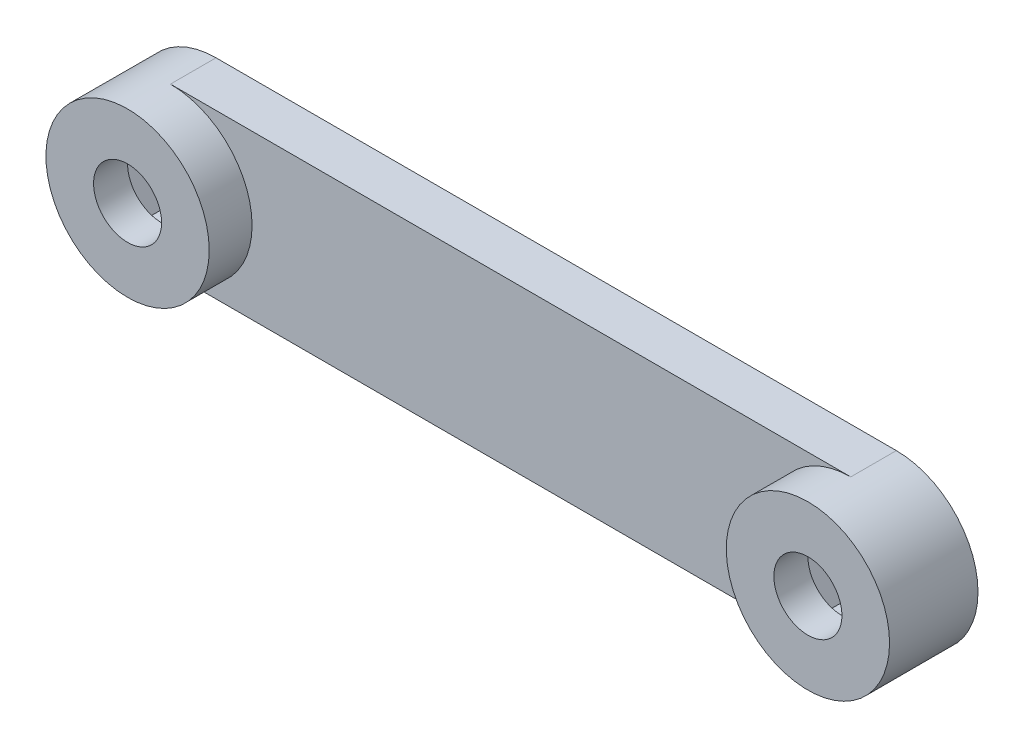
ISO-10303-21;
HEADER;
FILE_DESCRIPTION(('STEP AP214'),'2;1');
FILE_NAME('part.step','',(''),(''),'','','');
FILE_SCHEMA(('AUTOMOTIVE_DESIGN { 1 0 10303 214 1 1 1 1 }'));
ENDSEC;
DATA;
#1=APPLICATION_CONTEXT('core data for automotive mechanical design processes');
#2=APPLICATION_PROTOCOL_DEFINITION('international standard','automotive_design',2000,#1);
#3=PRODUCT_CONTEXT('',#1,'mechanical');
#4=PRODUCT('Part','Part','',(#3));
#5=PRODUCT_RELATED_PRODUCT_CATEGORY('part','',(#4));
#6=PRODUCT_DEFINITION_FORMATION('','',#4);
#7=PRODUCT_DEFINITION_CONTEXT('part definition',#1,'design');
#8=PRODUCT_DEFINITION('design','',#6,#7);
#9=PRODUCT_DEFINITION_SHAPE('','',#8);
#10=(LENGTH_UNIT() NAMED_UNIT(*) SI_UNIT(.MILLI.,.METRE.));
#11=(NAMED_UNIT(*) PLANE_ANGLE_UNIT() SI_UNIT($,.RADIAN.));
#12=(NAMED_UNIT(*) SI_UNIT($,.STERADIAN.) SOLID_ANGLE_UNIT());
#13=UNCERTAINTY_MEASURE_WITH_UNIT(LENGTH_MEASURE(1.E-05),#10,'distance_accuracy_value','');
#14=(GEOMETRIC_REPRESENTATION_CONTEXT(3) GLOBAL_UNCERTAINTY_ASSIGNED_CONTEXT((#13)) GLOBAL_UNIT_ASSIGNED_CONTEXT((#10,
#11,#12)) REPRESENTATION_CONTEXT('',''));
#15=CARTESIAN_POINT('',(0.,0.,0.));
#16=DIRECTION('',(0.,0.,1.));
#17=DIRECTION('',(1.,0.,0.));
#18=AXIS2_PLACEMENT_3D('',#15,#16,#17);
#19=CARTESIAN_POINT('',(25.,0.,3.35));
#20=DIRECTION('',(0.,0.,-1.));
#21=DIRECTION('',(-1.,0.,0.));
#22=AXIS2_PLACEMENT_3D('',#19,#20,#21);
#23=CYLINDRICAL_SURFACE('',#22,2.5);
#24=CARTESIAN_POINT('',(25.,0.,6.5));
#25=DIRECTION('',(0.,0.,1.));
#26=DIRECTION('',(1.,0.,0.));
#27=AXIS2_PLACEMENT_3D('',#24,#25,#26);
#28=CIRCLE('',#27,2.5);
#29=CARTESIAN_POINT('',(27.5,0.,6.5));
#30=VERTEX_POINT('',#29);
#31=EDGE_CURVE('E249',#30,#30,#28,.T.);
#32=ORIENTED_EDGE('',*,*,#31,.T.);
#33=EDGE_LOOP('',(#32));
#34=FACE_BOUND('',#33,.T.);
#35=CARTESIAN_POINT('',(25.,0.,4.));
#36=DIRECTION('',(0.,0.,-1.));
#37=DIRECTION('',(-1.,0.,0.));
#38=AXIS2_PLACEMENT_3D('',#35,#36,#37);
#39=CIRCLE('',#38,2.5);
#40=CARTESIAN_POINT('',(22.5,0.,4.));
#41=VERTEX_POINT('',#40);
#42=EDGE_CURVE('E196',#41,#41,#39,.T.);
#43=ORIENTED_EDGE('',*,*,#42,.T.);
#44=EDGE_LOOP('',(#43));
#45=FACE_BOUND('',#44,.T.);
#46=ADVANCED_FACE('F33',(#34,#45),#23,.F.);
#47=CARTESIAN_POINT('',(-25.,0.,3.35));
#48=DIRECTION('',(0.,0.,1.));
#49=DIRECTION('',(1.,0.,0.));
#50=AXIS2_PLACEMENT_3D('',#47,#48,#49);
#51=PLANE('',#50);
#52=DIRECTION('',(1.,0.,0.));
#53=VECTOR('',#52,1.);
#54=CARTESIAN_POINT('',(-25.,-6.00000000000001,3.35));
#55=LINE('',#54,#53);
#56=CARTESIAN_POINT('',(-25.,-6.00000000000001,3.35));
#57=VERTEX_POINT('',#56);
#58=CARTESIAN_POINT('',(25.,-5.99999999999999,3.35));
#59=VERTEX_POINT('',#58);
#60=EDGE_CURVE('E265',#57,#59,#55,.T.);
#61=ORIENTED_EDGE('',*,*,#60,.T.);
#62=CARTESIAN_POINT('',(25.,0.,3.35));
#63=DIRECTION('',(0.,0.,1.));
#64=DIRECTION('',(1.,0.,0.));
#65=AXIS2_PLACEMENT_3D('',#62,#63,#64);
#66=CIRCLE('',#65,6.);
#67=CARTESIAN_POINT('',(25.,6.00000000000002,3.35));
#68=VERTEX_POINT('',#67);
#69=EDGE_CURVE('E252',#68,#59,#66,.T.);
#70=ORIENTED_EDGE('',*,*,#69,.F.);
#71=DIRECTION('',(-1.,0.,0.));
#72=VECTOR('',#71,1.);
#73=CARTESIAN_POINT('',(-25.,6.00000000000001,3.35));
#74=LINE('',#73,#72);
#75=CARTESIAN_POINT('',(-25.,6.,3.35));
#76=VERTEX_POINT('',#75);
#77=EDGE_CURVE('E267',#68,#76,#74,.T.);
#78=ORIENTED_EDGE('',*,*,#77,.T.);
#79=CARTESIAN_POINT('',(-25.,0.,3.35));
#80=DIRECTION('',(0.,0.,1.));
#81=DIRECTION('',(1.,0.,0.));
#82=AXIS2_PLACEMENT_3D('',#79,#80,#81);
#83=CIRCLE('',#82,6.00000000000001);
#84=EDGE_CURVE('E11',#57,#76,#83,.T.);
#85=ORIENTED_EDGE('',*,*,#84,.F.);
#86=EDGE_LOOP('',(#61,#70,#78,#85));
#87=FACE_BOUND('',#86,.T.);
#88=ADVANCED_FACE('F317',(#87),#51,.T.);
#89=CARTESIAN_POINT('',(-25.,0.,0.));
#90=DIRECTION('',(0.,0.,1.));
#91=DIRECTION('',(1.,0.,0.));
#92=AXIS2_PLACEMENT_3D('',#89,#90,#91);
#93=PLANE('',#92);
#94=DIRECTION('',(1.,0.,0.));
#95=VECTOR('',#94,1.);
#96=CARTESIAN_POINT('',(22.719466436701,3.95000000000001,0.));
#97=LINE('',#96,#95);
#98=CARTESIAN_POINT('',(22.719466436701,3.95000000000001,0.));
#99=VERTEX_POINT('',#98);
#100=CARTESIAN_POINT('',(27.280533563299,3.95000000000001,0.));
#101=VERTEX_POINT('',#100);
#102=EDGE_CURVE('E183',#99,#101,#97,.T.);
#103=ORIENTED_EDGE('',*,*,#102,.F.);
#104=DIRECTION('',(0.5,0.866025403784439,0.));
#105=VECTOR('',#104,1.);
#106=CARTESIAN_POINT('',(20.438932873402,0.,0.));
#107=LINE('',#106,#105);
#108=CARTESIAN_POINT('',(20.438932873402,0.,0.));
#109=VERTEX_POINT('',#108);
#110=EDGE_CURVE('E50',#109,#99,#107,.T.);
#111=ORIENTED_EDGE('',*,*,#110,.F.);
#112=DIRECTION('',(-0.5,0.866025403784439,0.));
#113=VECTOR('',#112,1.);
#114=CARTESIAN_POINT('',(22.719466436701,-3.95,0.));
#115=LINE('',#114,#113);
#116=CARTESIAN_POINT('',(22.719466436701,-3.95,0.));
#117=VERTEX_POINT('',#116);
#118=EDGE_CURVE('E169',#117,#109,#115,.T.);
#119=ORIENTED_EDGE('',*,*,#118,.F.);
#120=DIRECTION('',(-1.,0.,0.));
#121=VECTOR('',#120,1.);
#122=CARTESIAN_POINT('',(27.280533563299,-3.95,0.));
#123=LINE('',#122,#121);
#124=CARTESIAN_POINT('',(27.280533563299,-3.95,0.));
#125=VERTEX_POINT('',#124);
#126=EDGE_CURVE('E172',#125,#117,#123,.T.);
#127=ORIENTED_EDGE('',*,*,#126,.F.);
#128=DIRECTION('',(-0.5,-0.866025403784438,0.));
#129=VECTOR('',#128,1.);
#130=CARTESIAN_POINT('',(29.561067126598,0.,0.));
#131=LINE('',#130,#129);
#132=CARTESIAN_POINT('',(29.561067126598,0.,0.));
#133=VERTEX_POINT('',#132);
#134=EDGE_CURVE('E189',#133,#125,#131,.T.);
#135=ORIENTED_EDGE('',*,*,#134,.F.);
#136=DIRECTION('',(0.5,-0.866025403784439,0.));
#137=VECTOR('',#136,1.);
#138=CARTESIAN_POINT('',(27.280533563299,3.95000000000001,0.));
#139=LINE('',#138,#137);
#140=EDGE_CURVE('E186',#101,#133,#139,.T.);
#141=ORIENTED_EDGE('',*,*,#140,.F.);
#142=EDGE_LOOP('',(#103,#111,#119,#127,#135,#141));
#143=FACE_BOUND('',#142,.T.);
#144=DIRECTION('',(-1.,0.,0.));
#145=VECTOR('',#144,1.);
#146=CARTESIAN_POINT('',(-27.280533563299,-3.94999999999999,0.));
#147=LINE('',#146,#145);
#148=CARTESIAN_POINT('',(-22.719466436701,-3.94999999999999,0.));
#149=VERTEX_POINT('',#148);
#150=CARTESIAN_POINT('',(-27.280533563299,-3.94999999999999,0.));
#151=VERTEX_POINT('',#150);
#152=EDGE_CURVE('E225',#149,#151,#147,.T.);
#153=ORIENTED_EDGE('',*,*,#152,.F.);
#154=DIRECTION('',(-0.500000000000001,-0.866025403784438,0.));
#155=VECTOR('',#154,1.);
#156=CARTESIAN_POINT('',(-22.719466436701,-3.94999999999999,0.));
#157=LINE('',#156,#155);
#158=CARTESIAN_POINT('',(-20.438932873402,0.,0.));
#159=VERTEX_POINT('',#158);
#160=EDGE_CURVE('E58',#159,#149,#157,.T.);
#161=ORIENTED_EDGE('',*,*,#160,.F.);
#162=DIRECTION('',(0.5,-0.866025403784439,0.));
#163=VECTOR('',#162,1.);
#164=CARTESIAN_POINT('',(-20.438932873402,0.,0.));
#165=LINE('',#164,#163);
#166=CARTESIAN_POINT('',(-22.719466436701,3.95000000000001,0.));
#167=VERTEX_POINT('',#166);
#168=EDGE_CURVE('E208',#167,#159,#165,.T.);
#169=ORIENTED_EDGE('',*,*,#168,.F.);
#170=DIRECTION('',(1.,0.,0.));
#171=VECTOR('',#170,1.);
#172=CARTESIAN_POINT('',(-22.719466436701,3.95000000000001,0.));
#173=LINE('',#172,#171);
#174=CARTESIAN_POINT('',(-27.280533563299,3.95000000000002,0.));
#175=VERTEX_POINT('',#174);
#176=EDGE_CURVE('E234',#175,#167,#173,.T.);
#177=ORIENTED_EDGE('',*,*,#176,.F.);
#178=DIRECTION('',(0.5,0.866025403784439,0.));
#179=VECTOR('',#178,1.);
#180=CARTESIAN_POINT('',(-27.280533563299,3.95000000000002,0.));
#181=LINE('',#180,#179);
#182=CARTESIAN_POINT('',(-29.561067126598,0.,0.));
#183=VERTEX_POINT('',#182);
#184=EDGE_CURVE('E231',#183,#175,#181,.T.);
#185=ORIENTED_EDGE('',*,*,#184,.F.);
#186=DIRECTION('',(-0.499999999999999,0.866025403784439,0.));
#187=VECTOR('',#186,1.);
#188=CARTESIAN_POINT('',(-29.561067126598,0.,0.));
#189=LINE('',#188,#187);
#190=EDGE_CURVE('E228',#151,#183,#189,.T.);
#191=ORIENTED_EDGE('',*,*,#190,.F.);
#192=EDGE_LOOP('',(#153,#161,#169,#177,#185,#191));
#193=FACE_BOUND('',#192,.T.);
#194=CARTESIAN_POINT('',(-25.,0.,0.));
#195=DIRECTION('',(0.,0.,1.));
#196=DIRECTION('',(1.,0.,0.));
#197=AXIS2_PLACEMENT_3D('',#194,#195,#196);
#198=CIRCLE('',#197,6.00000000000001);
#199=CARTESIAN_POINT('',(-25.,6.00000000000001,0.));
#200=VERTEX_POINT('',#199);
#201=CARTESIAN_POINT('',(-25.,-6.00000000000001,0.));
#202=VERTEX_POINT('',#201);
#203=EDGE_CURVE('E263',#200,#202,#198,.T.);
#204=ORIENTED_EDGE('',*,*,#203,.F.);
#205=DIRECTION('',(-1.,0.,0.));
#206=VECTOR('',#205,1.);
#207=CARTESIAN_POINT('',(-25.,6.00000000000001,0.));
#208=LINE('',#207,#206);
#209=CARTESIAN_POINT('',(25.,6.00000000000002,0.));
#210=VERTEX_POINT('',#209);
#211=EDGE_CURVE('E268',#210,#200,#208,.T.);
#212=ORIENTED_EDGE('',*,*,#211,.F.);
#213=CARTESIAN_POINT('',(25.,0.,0.));
#214=DIRECTION('',(0.,0.,1.));
#215=DIRECTION('',(1.,0.,0.));
#216=AXIS2_PLACEMENT_3D('',#213,#214,#215);
#217=CIRCLE('',#216,6.00000000000001);
#218=CARTESIAN_POINT('',(25.,-5.99999999999999,0.));
#219=VERTEX_POINT('',#218);
#220=EDGE_CURVE('E276',#219,#210,#217,.T.);
#221=ORIENTED_EDGE('',*,*,#220,.F.);
#222=DIRECTION('',(1.,0.,0.));
#223=VECTOR('',#222,1.);
#224=CARTESIAN_POINT('',(-25.,-6.00000000000001,0.));
#225=LINE('',#224,#223);
#226=EDGE_CURVE('E274',#202,#219,#225,.T.);
#227=ORIENTED_EDGE('',*,*,#226,.F.);
#228=EDGE_LOOP('',(#204,#212,#221,#227));
#229=FACE_BOUND('',#228,.T.);
#230=ADVANCED_FACE('F324',(#143,#193,#229),#93,.F.);
#231=CARTESIAN_POINT('',(-25.,0.,3.35));
#232=DIRECTION('',(0.,0.,-1.));
#233=DIRECTION('',(-1.,0.,0.));
#234=AXIS2_PLACEMENT_3D('',#231,#232,#233);
#235=CYLINDRICAL_SURFACE('',#234,6.00000000000001);
#236=ORIENTED_EDGE('',*,*,#203,.T.);
#237=DIRECTION('',(0.,0.,-1.));
#238=VECTOR('',#237,1.);
#239=CARTESIAN_POINT('',(-25.,-6.00000000000001,3.35));
#240=LINE('',#239,#238);
#241=EDGE_CURVE('E42',#57,#202,#240,.T.);
#242=ORIENTED_EDGE('',*,*,#241,.F.);
#243=ORIENTED_EDGE('',*,*,#84,.T.);
#244=DIRECTION('',(0.,0.,-1.));
#245=VECTOR('',#244,1.);
#246=CARTESIAN_POINT('',(-25.,6.00000000000001,3.35));
#247=LINE('',#246,#245);
#248=EDGE_CURVE('E271',#76,#200,#247,.T.);
#249=ORIENTED_EDGE('',*,*,#248,.T.);
#250=EDGE_LOOP('',(#236,#242,#243,#249));
#251=FACE_BOUND('',#250,.T.);
#252=CARTESIAN_POINT('',(-25.,0.,6.5));
#253=DIRECTION('',(0.,0.,1.));
#254=DIRECTION('',(1.,0.,0.));
#255=AXIS2_PLACEMENT_3D('',#252,#253,#254);
#256=CIRCLE('',#255,6.00000000000001);
#257=CARTESIAN_POINT('',(-19.,0.,6.5));
#258=VERTEX_POINT('',#257);
#259=EDGE_CURVE('E261',#258,#258,#256,.T.);
#260=ORIENTED_EDGE('',*,*,#259,.F.);
#261=EDGE_LOOP('',(#260));
#262=FACE_BOUND('',#261,.T.);
#263=ADVANCED_FACE('F35',(#251,#262),#235,.T.);
#264=CARTESIAN_POINT('',(-25.,-6.00000000000001,3.35));
#265=DIRECTION('',(0.,1.,0.));
#266=DIRECTION('',(-1.,0.,0.));
#267=AXIS2_PLACEMENT_3D('',#264,#265,#266);
#268=PLANE('',#267);
#269=ORIENTED_EDGE('',*,*,#226,.T.);
#270=DIRECTION('',(0.,0.,-1.));
#271=VECTOR('',#270,1.);
#272=CARTESIAN_POINT('',(25.,-5.99999999999999,3.35));
#273=LINE('',#272,#271);
#274=EDGE_CURVE('E284',#59,#219,#273,.T.);
#275=ORIENTED_EDGE('',*,*,#274,.F.);
#276=ORIENTED_EDGE('',*,*,#60,.F.);
#277=ORIENTED_EDGE('',*,*,#241,.T.);
#278=EDGE_LOOP('',(#269,#275,#276,#277));
#279=FACE_BOUND('',#278,.T.);
#280=ADVANCED_FACE('F335',(#279),#268,.F.);
#281=CARTESIAN_POINT('',(25.,0.,3.35));
#282=DIRECTION('',(0.,0.,-1.));
#283=DIRECTION('',(-1.,0.,0.));
#284=AXIS2_PLACEMENT_3D('',#281,#282,#283);
#285=CYLINDRICAL_SURFACE('',#284,6.00000000000001);
#286=ORIENTED_EDGE('',*,*,#220,.T.);
#287=DIRECTION('',(0.,0.,-1.));
#288=VECTOR('',#287,1.);
#289=CARTESIAN_POINT('',(25.,6.00000000000002,3.35));
#290=LINE('',#289,#288);
#291=EDGE_CURVE('E281',#68,#210,#290,.T.);
#292=ORIENTED_EDGE('',*,*,#291,.F.);
#293=ORIENTED_EDGE('',*,*,#69,.T.);
#294=ORIENTED_EDGE('',*,*,#274,.T.);
#295=EDGE_LOOP('',(#286,#292,#293,#294));
#296=FACE_BOUND('',#295,.T.);
#297=CARTESIAN_POINT('',(25.,0.,6.5));
#298=DIRECTION('',(0.,0.,1.));
#299=DIRECTION('',(1.,0.,0.));
#300=AXIS2_PLACEMENT_3D('',#297,#298,#299);
#301=CIRCLE('',#300,6.);
#302=CARTESIAN_POINT('',(31.,0.,6.5));
#303=VERTEX_POINT('',#302);
#304=EDGE_CURVE('E253',#303,#303,#301,.T.);
#305=ORIENTED_EDGE('',*,*,#304,.F.);
#306=EDGE_LOOP('',(#305));
#307=FACE_BOUND('',#306,.T.);
#308=ADVANCED_FACE('F332',(#296,#307),#285,.T.);
#309=CARTESIAN_POINT('',(-25.,6.00000000000001,3.35));
#310=DIRECTION('',(0.,-1.,0.));
#311=DIRECTION('',(1.,0.,0.));
#312=AXIS2_PLACEMENT_3D('',#309,#310,#311);
#313=PLANE('',#312);
#314=ORIENTED_EDGE('',*,*,#211,.T.);
#315=ORIENTED_EDGE('',*,*,#248,.F.);
#316=ORIENTED_EDGE('',*,*,#77,.F.);
#317=ORIENTED_EDGE('',*,*,#291,.T.);
#318=EDGE_LOOP('',(#314,#315,#316,#317));
#319=FACE_BOUND('',#318,.T.);
#320=ADVANCED_FACE('F301',(#319),#313,.F.);
#321=CARTESIAN_POINT('',(-25.,0.,3.35));
#322=DIRECTION('',(0.,0.,-1.));
#323=DIRECTION('',(-1.,0.,0.));
#324=AXIS2_PLACEMENT_3D('',#321,#322,#323);
#325=CYLINDRICAL_SURFACE('',#324,2.5);
#326=CARTESIAN_POINT('',(-25.,0.,4.));
#327=DIRECTION('',(0.,0.,1.));
#328=DIRECTION('',(1.,0.,0.));
#329=AXIS2_PLACEMENT_3D('',#326,#327,#328);
#330=CIRCLE('',#329,2.5);
#331=CARTESIAN_POINT('',(-22.5,0.,4.));
#332=VERTEX_POINT('',#331);
#333=EDGE_CURVE('E37',#332,#332,#330,.T.);
#334=ORIENTED_EDGE('',*,*,#333,.F.);
#335=EDGE_LOOP('',(#334));
#336=FACE_BOUND('',#335,.T.);
#337=CARTESIAN_POINT('',(-25.,0.,6.5));
#338=DIRECTION('',(0.,0.,1.));
#339=DIRECTION('',(1.,0.,0.));
#340=AXIS2_PLACEMENT_3D('',#337,#338,#339);
#341=CIRCLE('',#340,2.5);
#342=CARTESIAN_POINT('',(-22.5,0.,6.5));
#343=VERTEX_POINT('',#342);
#344=EDGE_CURVE('E256',#343,#343,#341,.T.);
#345=ORIENTED_EDGE('',*,*,#344,.T.);
#346=EDGE_LOOP('',(#345));
#347=FACE_BOUND('',#346,.T.);
#348=ADVANCED_FACE('F297',(#336,#347),#325,.F.);
#349=CARTESIAN_POINT('',(-25.,0.,6.5));
#350=DIRECTION('',(0.,0.,1.));
#351=DIRECTION('',(1.,0.,0.));
#352=AXIS2_PLACEMENT_3D('',#349,#350,#351);
#353=PLANE('',#352);
#354=ORIENTED_EDGE('',*,*,#259,.T.);
#355=EDGE_LOOP('',(#354));
#356=FACE_BOUND('',#355,.T.);
#357=ORIENTED_EDGE('',*,*,#344,.F.);
#358=EDGE_LOOP('',(#357));
#359=FACE_BOUND('',#358,.T.);
#360=ADVANCED_FACE('F300',(#356,#359),#353,.T.);
#361=CARTESIAN_POINT('',(25.,0.,6.5));
#362=DIRECTION('',(0.,0.,1.));
#363=DIRECTION('',(1.,0.,0.));
#364=AXIS2_PLACEMENT_3D('',#361,#362,#363);
#365=PLANE('',#364);
#366=ORIENTED_EDGE('',*,*,#304,.T.);
#367=EDGE_LOOP('',(#366));
#368=FACE_BOUND('',#367,.T.);
#369=ORIENTED_EDGE('',*,*,#31,.F.);
#370=EDGE_LOOP('',(#369));
#371=FACE_BOUND('',#370,.T.);
#372=ADVANCED_FACE('F306',(#368,#371),#365,.T.);
#373=CARTESIAN_POINT('',(20.438932873402,0.,4.));
#374=DIRECTION('',(-0.866025403784439,0.5,0.));
#375=DIRECTION('',(-0.5,-0.866025403784439,0.));
#376=AXIS2_PLACEMENT_3D('',#373,#374,#375);
#377=PLANE('',#376);
#378=ORIENTED_EDGE('',*,*,#110,.T.);
#379=DIRECTION('',(0.,0.,-1.));
#380=VECTOR('',#379,1.);
#381=CARTESIAN_POINT('',(22.719466436701,3.95000000000001,4.));
#382=LINE('',#381,#380);
#383=CARTESIAN_POINT('',(22.719466436701,3.95000000000001,4.));
#384=VERTEX_POINT('',#383);
#385=EDGE_CURVE('E146',#384,#99,#382,.T.);
#386=ORIENTED_EDGE('',*,*,#385,.F.);
#387=DIRECTION('',(0.5,0.866025403784439,0.));
#388=VECTOR('',#387,1.);
#389=CARTESIAN_POINT('',(20.438932873402,0.,4.));
#390=LINE('',#389,#388);
#391=CARTESIAN_POINT('',(20.438932873402,0.,4.));
#392=VERTEX_POINT('',#391);
#393=EDGE_CURVE('E150',#392,#384,#390,.T.);
#394=ORIENTED_EDGE('',*,*,#393,.F.);
#395=DIRECTION('',(0.,0.,-1.));
#396=VECTOR('',#395,1.);
#397=CARTESIAN_POINT('',(20.438932873402,0.,4.));
#398=LINE('',#397,#396);
#399=EDGE_CURVE('E194',#392,#109,#398,.T.);
#400=ORIENTED_EDGE('',*,*,#399,.T.);
#401=EDGE_LOOP('',(#378,#386,#394,#400));
#402=FACE_BOUND('',#401,.T.);
#403=ADVANCED_FACE('F148',(#402),#377,.F.);
#404=CARTESIAN_POINT('',(22.719466436701,-3.95,4.));
#405=DIRECTION('',(-0.866025403784439,-0.5,0.));
#406=DIRECTION('',(0.5,-0.866025403784439,0.));
#407=AXIS2_PLACEMENT_3D('',#404,#405,#406);
#408=PLANE('',#407);
#409=ORIENTED_EDGE('',*,*,#118,.T.);
#410=ORIENTED_EDGE('',*,*,#399,.F.);
#411=DIRECTION('',(-0.5,0.866025403784439,0.));
#412=VECTOR('',#411,1.);
#413=CARTESIAN_POINT('',(22.719466436701,-3.95,4.));
#414=LINE('',#413,#412);
#415=CARTESIAN_POINT('',(22.719466436701,-3.95,4.));
#416=VERTEX_POINT('',#415);
#417=EDGE_CURVE('E156',#416,#392,#414,.T.);
#418=ORIENTED_EDGE('',*,*,#417,.F.);
#419=DIRECTION('',(0.,0.,-1.));
#420=VECTOR('',#419,1.);
#421=CARTESIAN_POINT('',(22.719466436701,-3.95,4.));
#422=LINE('',#421,#420);
#423=EDGE_CURVE('E197',#416,#117,#422,.T.);
#424=ORIENTED_EDGE('',*,*,#423,.T.);
#425=EDGE_LOOP('',(#409,#410,#418,#424));
#426=FACE_BOUND('',#425,.T.);
#427=ADVANCED_FACE('F383',(#426),#408,.F.);
#428=CARTESIAN_POINT('',(27.280533563299,-3.95,4.));
#429=DIRECTION('',(0.,-1.,0.));
#430=DIRECTION('',(1.,0.,0.));
#431=AXIS2_PLACEMENT_3D('',#428,#429,#430);
#432=PLANE('',#431);
#433=ORIENTED_EDGE('',*,*,#126,.T.);
#434=ORIENTED_EDGE('',*,*,#423,.F.);
#435=DIRECTION('',(-1.,0.,0.));
#436=VECTOR('',#435,1.);
#437=CARTESIAN_POINT('',(27.280533563299,-3.95,4.));
#438=LINE('',#437,#436);
#439=CARTESIAN_POINT('',(27.280533563299,-3.95,4.));
#440=VERTEX_POINT('',#439);
#441=EDGE_CURVE('E179',#440,#416,#438,.T.);
#442=ORIENTED_EDGE('',*,*,#441,.F.);
#443=DIRECTION('',(0.,0.,-1.));
#444=VECTOR('',#443,1.);
#445=CARTESIAN_POINT('',(27.280533563299,-3.95,4.));
#446=LINE('',#445,#444);
#447=EDGE_CURVE('E199',#440,#125,#446,.T.);
#448=ORIENTED_EDGE('',*,*,#447,.T.);
#449=EDGE_LOOP('',(#433,#434,#442,#448));
#450=FACE_BOUND('',#449,.T.);
#451=ADVANCED_FACE('F393',(#450),#432,.F.);
#452=CARTESIAN_POINT('',(29.561067126598,0.,4.));
#453=DIRECTION('',(0.866025403784438,-0.5,0.));
#454=DIRECTION('',(0.5,0.866025403784438,0.));
#455=AXIS2_PLACEMENT_3D('',#452,#453,#454);
#456=PLANE('',#455);
#457=ORIENTED_EDGE('',*,*,#134,.T.);
#458=ORIENTED_EDGE('',*,*,#447,.F.);
#459=DIRECTION('',(-0.5,-0.866025403784438,0.));
#460=VECTOR('',#459,1.);
#461=CARTESIAN_POINT('',(29.561067126598,0.,4.));
#462=LINE('',#461,#460);
#463=CARTESIAN_POINT('',(29.561067126598,0.,4.));
#464=VERTEX_POINT('',#463);
#465=EDGE_CURVE('E176',#464,#440,#462,.T.);
#466=ORIENTED_EDGE('',*,*,#465,.F.);
#467=DIRECTION('',(0.,0.,-1.));
#468=VECTOR('',#467,1.);
#469=CARTESIAN_POINT('',(29.561067126598,0.,4.));
#470=LINE('',#469,#468);
#471=EDGE_CURVE('E201',#464,#133,#470,.T.);
#472=ORIENTED_EDGE('',*,*,#471,.T.);
#473=EDGE_LOOP('',(#457,#458,#466,#472));
#474=FACE_BOUND('',#473,.T.);
#475=ADVANCED_FACE('F403',(#474),#456,.F.);
#476=CARTESIAN_POINT('',(27.280533563299,3.95000000000001,4.));
#477=DIRECTION('',(0.866025403784439,0.5,0.));
#478=DIRECTION('',(-0.5,0.866025403784439,0.));
#479=AXIS2_PLACEMENT_3D('',#476,#477,#478);
#480=PLANE('',#479);
#481=ORIENTED_EDGE('',*,*,#140,.T.);
#482=ORIENTED_EDGE('',*,*,#471,.F.);
#483=DIRECTION('',(0.5,-0.866025403784439,0.));
#484=VECTOR('',#483,1.);
#485=CARTESIAN_POINT('',(27.280533563299,3.95000000000001,4.));
#486=LINE('',#485,#484);
#487=CARTESIAN_POINT('',(27.280533563299,3.95000000000001,4.));
#488=VERTEX_POINT('',#487);
#489=EDGE_CURVE('E164',#488,#464,#486,.T.);
#490=ORIENTED_EDGE('',*,*,#489,.F.);
#491=DIRECTION('',(0.,0.,-1.));
#492=VECTOR('',#491,1.);
#493=CARTESIAN_POINT('',(27.280533563299,3.95000000000001,4.));
#494=LINE('',#493,#492);
#495=EDGE_CURVE('E155',#488,#101,#494,.T.);
#496=ORIENTED_EDGE('',*,*,#495,.T.);
#497=EDGE_LOOP('',(#481,#482,#490,#496));
#498=FACE_BOUND('',#497,.T.);
#499=ADVANCED_FACE('F413',(#498),#480,.F.);
#500=CARTESIAN_POINT('',(22.719466436701,3.95000000000001,4.));
#501=DIRECTION('',(0.,1.,0.));
#502=DIRECTION('',(0.,0.,1.));
#503=AXIS2_PLACEMENT_3D('',#500,#501,#502);
#504=PLANE('',#503);
#505=ORIENTED_EDGE('',*,*,#102,.T.);
#506=ORIENTED_EDGE('',*,*,#495,.F.);
#507=DIRECTION('',(1.,0.,0.));
#508=VECTOR('',#507,1.);
#509=CARTESIAN_POINT('',(22.719466436701,3.95000000000001,4.));
#510=LINE('',#509,#508);
#511=EDGE_CURVE('E159',#384,#488,#510,.T.);
#512=ORIENTED_EDGE('',*,*,#511,.F.);
#513=ORIENTED_EDGE('',*,*,#385,.T.);
#514=EDGE_LOOP('',(#505,#506,#512,#513));
#515=FACE_BOUND('',#514,.T.);
#516=ADVANCED_FACE('F160',(#515),#504,.F.);
#517=CARTESIAN_POINT('',(0.,0.,4.));
#518=DIRECTION('',(0.,0.,-1.));
#519=DIRECTION('',(-1.,0.,0.));
#520=AXIS2_PLACEMENT_3D('',#517,#518,#519);
#521=PLANE('',#520);
#522=ORIENTED_EDGE('',*,*,#42,.F.);
#523=EDGE_LOOP('',(#522));
#524=FACE_BOUND('',#523,.T.);
#525=ORIENTED_EDGE('',*,*,#393,.T.);
#526=ORIENTED_EDGE('',*,*,#511,.T.);
#527=ORIENTED_EDGE('',*,*,#489,.T.);
#528=ORIENTED_EDGE('',*,*,#465,.T.);
#529=ORIENTED_EDGE('',*,*,#441,.T.);
#530=ORIENTED_EDGE('',*,*,#417,.T.);
#531=EDGE_LOOP('',(#525,#526,#527,#528,#529,#530));
#532=FACE_BOUND('',#531,.T.);
#533=ADVANCED_FACE('F166',(#524,#532),#521,.T.);
#534=CARTESIAN_POINT('',(-22.719466436701,-3.94999999999999,4.));
#535=DIRECTION('',(0.866025403784438,-0.500000000000001,0.));
#536=DIRECTION('',(0.500000000000001,0.866025403784438,0.));
#537=AXIS2_PLACEMENT_3D('',#534,#535,#536);
#538=PLANE('',#537);
#539=ORIENTED_EDGE('',*,*,#160,.T.);
#540=DIRECTION('',(0.,0.,-1.));
#541=VECTOR('',#540,1.);
#542=CARTESIAN_POINT('',(-22.719466436701,-3.94999999999999,4.));
#543=LINE('',#542,#541);
#544=CARTESIAN_POINT('',(-22.719466436701,-3.94999999999999,4.));
#545=VERTEX_POINT('',#544);
#546=EDGE_CURVE('E223',#545,#149,#543,.T.);
#547=ORIENTED_EDGE('',*,*,#546,.F.);
#548=DIRECTION('',(-0.500000000000001,-0.866025403784438,0.));
#549=VECTOR('',#548,1.);
#550=CARTESIAN_POINT('',(-22.719466436701,-3.94999999999999,4.));
#551=LINE('',#550,#549);
#552=CARTESIAN_POINT('',(-20.438932873402,0.,4.));
#553=VERTEX_POINT('',#552);
#554=EDGE_CURVE('E204',#553,#545,#551,.T.);
#555=ORIENTED_EDGE('',*,*,#554,.F.);
#556=DIRECTION('',(0.,0.,-1.));
#557=VECTOR('',#556,1.);
#558=CARTESIAN_POINT('',(-20.438932873402,0.,4.));
#559=LINE('',#558,#557);
#560=EDGE_CURVE('E184',#553,#159,#559,.T.);
#561=ORIENTED_EDGE('',*,*,#560,.T.);
#562=EDGE_LOOP('',(#539,#547,#555,#561));
#563=FACE_BOUND('',#562,.T.);
#564=ADVANCED_FACE('F440',(#563),#538,.F.);
#565=CARTESIAN_POINT('',(-20.438932873402,0.,4.));
#566=DIRECTION('',(0.866025403784439,0.5,0.));
#567=DIRECTION('',(-0.5,0.866025403784439,0.));
#568=AXIS2_PLACEMENT_3D('',#565,#566,#567);
#569=PLANE('',#568);
#570=ORIENTED_EDGE('',*,*,#168,.T.);
#571=ORIENTED_EDGE('',*,*,#560,.F.);
#572=DIRECTION('',(0.5,-0.866025403784439,0.));
#573=VECTOR('',#572,1.);
#574=CARTESIAN_POINT('',(-20.438932873402,0.,4.));
#575=LINE('',#574,#573);
#576=CARTESIAN_POINT('',(-22.719466436701,3.95000000000001,4.));
#577=VERTEX_POINT('',#576);
#578=EDGE_CURVE('E220',#577,#553,#575,.T.);
#579=ORIENTED_EDGE('',*,*,#578,.F.);
#580=DIRECTION('',(0.,0.,-1.));
#581=VECTOR('',#580,1.);
#582=CARTESIAN_POINT('',(-22.719466436701,3.95000000000001,4.));
#583=LINE('',#582,#581);
#584=EDGE_CURVE('E240',#577,#167,#583,.T.);
#585=ORIENTED_EDGE('',*,*,#584,.T.);
#586=EDGE_LOOP('',(#570,#571,#579,#585));
#587=FACE_BOUND('',#586,.T.);
#588=ADVANCED_FACE('F450',(#587),#569,.F.);
#589=CARTESIAN_POINT('',(-22.719466436701,3.95000000000001,4.));
#590=DIRECTION('',(0.,1.,0.));
#591=DIRECTION('',(-1.,0.,0.));
#592=AXIS2_PLACEMENT_3D('',#589,#590,#591);
#593=PLANE('',#592);
#594=ORIENTED_EDGE('',*,*,#176,.T.);
#595=ORIENTED_EDGE('',*,*,#584,.F.);
#596=DIRECTION('',(1.,0.,0.));
#597=VECTOR('',#596,1.);
#598=CARTESIAN_POINT('',(-22.719466436701,3.95000000000001,4.));
#599=LINE('',#598,#597);
#600=CARTESIAN_POINT('',(-27.280533563299,3.95000000000002,4.));
#601=VERTEX_POINT('',#600);
#602=EDGE_CURVE('E217',#601,#577,#599,.T.);
#603=ORIENTED_EDGE('',*,*,#602,.F.);
#604=DIRECTION('',(0.,0.,-1.));
#605=VECTOR('',#604,1.);
#606=CARTESIAN_POINT('',(-27.280533563299,3.95000000000002,4.));
#607=LINE('',#606,#605);
#608=EDGE_CURVE('E242',#601,#175,#607,.T.);
#609=ORIENTED_EDGE('',*,*,#608,.T.);
#610=EDGE_LOOP('',(#594,#595,#603,#609));
#611=FACE_BOUND('',#610,.T.);
#612=ADVANCED_FACE('F459',(#611),#593,.F.);
#613=CARTESIAN_POINT('',(-27.280533563299,3.95000000000002,4.));
#614=DIRECTION('',(-0.866025403784439,0.5,0.));
#615=DIRECTION('',(-0.5,-0.866025403784439,0.));
#616=AXIS2_PLACEMENT_3D('',#613,#614,#615);
#617=PLANE('',#616);
#618=ORIENTED_EDGE('',*,*,#184,.T.);
#619=ORIENTED_EDGE('',*,*,#608,.F.);
#620=DIRECTION('',(0.5,0.866025403784439,0.));
#621=VECTOR('',#620,1.);
#622=CARTESIAN_POINT('',(-27.280533563299,3.95000000000002,4.));
#623=LINE('',#622,#621);
#624=CARTESIAN_POINT('',(-29.561067126598,0.,4.));
#625=VERTEX_POINT('',#624);
#626=EDGE_CURVE('E214',#625,#601,#623,.T.);
#627=ORIENTED_EDGE('',*,*,#626,.F.);
#628=DIRECTION('',(0.,0.,-1.));
#629=VECTOR('',#628,1.);
#630=CARTESIAN_POINT('',(-29.561067126598,0.,4.));
#631=LINE('',#630,#629);
#632=EDGE_CURVE('E244',#625,#183,#631,.T.);
#633=ORIENTED_EDGE('',*,*,#632,.T.);
#634=EDGE_LOOP('',(#618,#619,#627,#633));
#635=FACE_BOUND('',#634,.T.);
#636=ADVANCED_FACE('F469',(#635),#617,.F.);
#637=CARTESIAN_POINT('',(-29.561067126598,0.,4.));
#638=DIRECTION('',(-0.866025403784439,-0.499999999999999,0.));
#639=DIRECTION('',(0.499999999999999,-0.866025403784439,0.));
#640=AXIS2_PLACEMENT_3D('',#637,#638,#639);
#641=PLANE('',#640);
#642=ORIENTED_EDGE('',*,*,#190,.T.);
#643=ORIENTED_EDGE('',*,*,#632,.F.);
#644=DIRECTION('',(-0.499999999999999,0.866025403784439,0.));
#645=VECTOR('',#644,1.);
#646=CARTESIAN_POINT('',(-29.561067126598,0.,4.));
#647=LINE('',#646,#645);
#648=CARTESIAN_POINT('',(-27.280533563299,-3.94999999999999,4.));
#649=VERTEX_POINT('',#648);
#650=EDGE_CURVE('E211',#649,#625,#647,.T.);
#651=ORIENTED_EDGE('',*,*,#650,.F.);
#652=DIRECTION('',(0.,0.,-1.));
#653=VECTOR('',#652,1.);
#654=CARTESIAN_POINT('',(-27.280533563299,-3.94999999999999,4.));
#655=LINE('',#654,#653);
#656=EDGE_CURVE('E246',#649,#151,#655,.T.);
#657=ORIENTED_EDGE('',*,*,#656,.T.);
#658=EDGE_LOOP('',(#642,#643,#651,#657));
#659=FACE_BOUND('',#658,.T.);
#660=ADVANCED_FACE('F479',(#659),#641,.F.);
#661=CARTESIAN_POINT('',(-27.280533563299,-3.94999999999999,4.));
#662=DIRECTION('',(0.,-1.,0.));
#663=DIRECTION('',(1.,0.,0.));
#664=AXIS2_PLACEMENT_3D('',#661,#662,#663);
#665=PLANE('',#664);
#666=ORIENTED_EDGE('',*,*,#152,.T.);
#667=ORIENTED_EDGE('',*,*,#656,.F.);
#668=DIRECTION('',(-1.,0.,0.));
#669=VECTOR('',#668,1.);
#670=CARTESIAN_POINT('',(-27.280533563299,-3.94999999999999,4.));
#671=LINE('',#670,#669);
#672=EDGE_CURVE('E207',#545,#649,#671,.T.);
#673=ORIENTED_EDGE('',*,*,#672,.F.);
#674=ORIENTED_EDGE('',*,*,#546,.T.);
#675=EDGE_LOOP('',(#666,#667,#673,#674));
#676=FACE_BOUND('',#675,.T.);
#677=ADVANCED_FACE('F489',(#676),#665,.F.);
#678=CARTESIAN_POINT('',(0.,0.,4.));
#679=DIRECTION('',(0.,0.,1.));
#680=DIRECTION('',(1.,0.,0.));
#681=AXIS2_PLACEMENT_3D('',#678,#679,#680);
#682=PLANE('',#681);
#683=ORIENTED_EDGE('',*,*,#333,.T.);
#684=EDGE_LOOP('',(#683));
#685=FACE_BOUND('',#684,.T.);
#686=ORIENTED_EDGE('',*,*,#554,.T.);
#687=ORIENTED_EDGE('',*,*,#672,.T.);
#688=ORIENTED_EDGE('',*,*,#650,.T.);
#689=ORIENTED_EDGE('',*,*,#626,.T.);
#690=ORIENTED_EDGE('',*,*,#602,.T.);
#691=ORIENTED_EDGE('',*,*,#578,.T.);
#692=EDGE_LOOP('',(#686,#687,#688,#689,#690,#691));
#693=FACE_BOUND('',#692,.T.);
#694=ADVANCED_FACE('F294',(#685,#693),#682,.F.);
#695=CLOSED_SHELL('',(#46,#88,#230,#263,#280,#308,#320,#348,#360,#372,#403,#427,#451,#475,#499,
#516,#533,#564,#588,#612,#636,#660,#677,#694));
#696=MANIFOLD_SOLID_BREP('B2',#695);
#697=ADVANCED_BREP_SHAPE_REPRESENTATION('',(#18,#696),#14);
#698=SHAPE_DEFINITION_REPRESENTATION(#9,#697);
ENDSEC;
END-ISO-10303-21;
